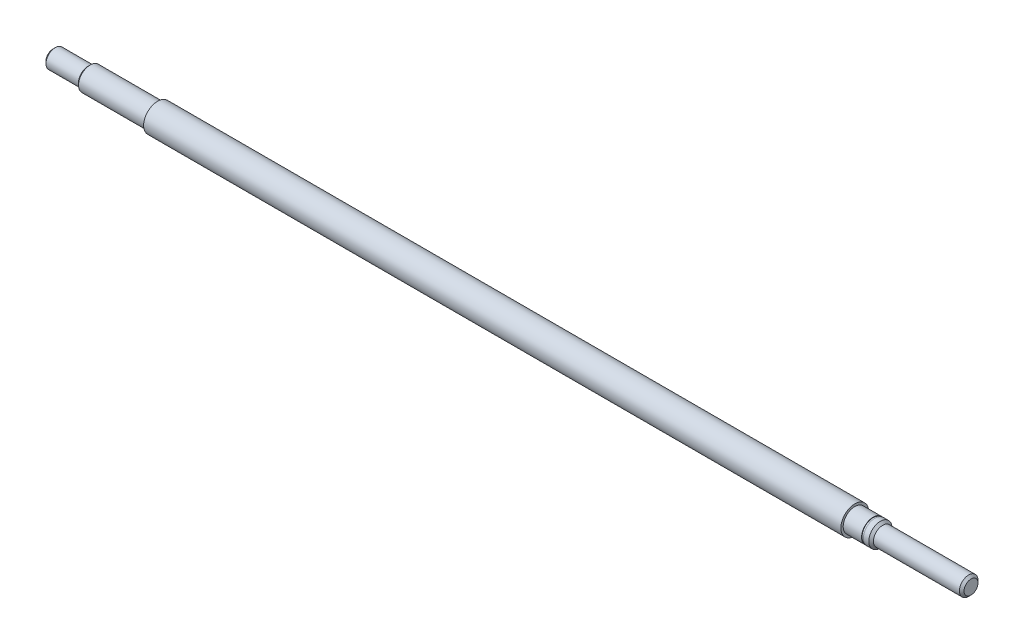
ISO-10303-21;
HEADER;
FILE_DESCRIPTION(('STEP AP214'),'2;1');
FILE_NAME('part.step','',(''),(''),'','','');
FILE_SCHEMA(('AUTOMOTIVE_DESIGN { 1 0 10303 214 1 1 1 1 }'));
ENDSEC;
DATA;
#1=APPLICATION_CONTEXT('core data for automotive mechanical design processes');
#2=APPLICATION_PROTOCOL_DEFINITION('international standard','automotive_design',2000,#1);
#3=PRODUCT_CONTEXT('',#1,'mechanical');
#4=PRODUCT('Part','Part','',(#3));
#5=PRODUCT_RELATED_PRODUCT_CATEGORY('part','',(#4));
#6=PRODUCT_DEFINITION_FORMATION('','',#4);
#7=PRODUCT_DEFINITION_CONTEXT('part definition',#1,'design');
#8=PRODUCT_DEFINITION('design','',#6,#7);
#9=PRODUCT_DEFINITION_SHAPE('','',#8);
#10=(LENGTH_UNIT() NAMED_UNIT(*) SI_UNIT(.MILLI.,.METRE.));
#11=(NAMED_UNIT(*) PLANE_ANGLE_UNIT() SI_UNIT($,.RADIAN.));
#12=(NAMED_UNIT(*) SI_UNIT($,.STERADIAN.) SOLID_ANGLE_UNIT());
#13=UNCERTAINTY_MEASURE_WITH_UNIT(LENGTH_MEASURE(1.E-05),#10,'distance_accuracy_value','');
#14=(GEOMETRIC_REPRESENTATION_CONTEXT(3) GLOBAL_UNCERTAINTY_ASSIGNED_CONTEXT((#13)) GLOBAL_UNIT_ASSIGNED_CONTEXT((#10,
#11,#12)) REPRESENTATION_CONTEXT('',''));
#15=CARTESIAN_POINT('',(0.,0.,0.));
#16=DIRECTION('',(0.,0.,1.));
#17=DIRECTION('',(1.,0.,0.));
#18=AXIS2_PLACEMENT_3D('',#15,#16,#17);
#19=CARTESIAN_POINT('',(0.,0.,0.));
#20=DIRECTION('',(-1.,0.,0.));
#21=DIRECTION('',(0.,0.,1.));
#22=AXIS2_PLACEMENT_3D('',#19,#20,#21);
#23=PLANE('',#22);
#24=CARTESIAN_POINT('',(0.,0.,0.));
#25=DIRECTION('',(-1.,0.,0.));
#26=DIRECTION('',(0.,0.,1.));
#27=AXIS2_PLACEMENT_3D('',#24,#25,#26);
#28=CIRCLE('',#27,3.00000000000006);
#29=CARTESIAN_POINT('',(0.,0.,3.00000000000006));
#30=VERTEX_POINT('',#29);
#31=EDGE_CURVE('E54',#30,#30,#28,.T.);
#32=ORIENTED_EDGE('',*,*,#31,.T.);
#33=EDGE_LOOP('',(#32));
#34=FACE_BOUND('',#33,.T.);
#35=ADVANCED_FACE('F47',(#34),#23,.T.);
#36=CARTESIAN_POINT('',(395.,0.,0.));
#37=DIRECTION('',(1.,0.,0.));
#38=DIRECTION('',(0.,0.,-1.));
#39=AXIS2_PLACEMENT_3D('',#36,#37,#38);
#40=PLANE('',#39);
#41=CARTESIAN_POINT('',(395.,0.,0.));
#42=DIRECTION('',(1.,0.,0.));
#43=DIRECTION('',(0.,0.,-1.));
#44=AXIS2_PLACEMENT_3D('',#41,#42,#43);
#45=CIRCLE('',#44,2.99999999999995);
#46=CARTESIAN_POINT('',(395.,0.,-2.99999999999995));
#47=VERTEX_POINT('',#46);
#48=EDGE_CURVE('E58',#47,#47,#45,.T.);
#49=ORIENTED_EDGE('',*,*,#48,.T.);
#50=EDGE_LOOP('',(#49));
#51=FACE_BOUND('',#50,.T.);
#52=ADVANCED_FACE('F123',(#51),#40,.T.);
#53=CARTESIAN_POINT('',(0.,0.,0.));
#54=DIRECTION('',(-1.,0.,0.));
#55=DIRECTION('',(0.,0.,1.));
#56=AXIS2_PLACEMENT_3D('',#53,#54,#55);
#57=CYLINDRICAL_SURFACE('',#56,4.);
#58=CARTESIAN_POINT('',(394.,0.,0.));
#59=DIRECTION('',(1.,0.,0.));
#60=DIRECTION('',(0.,0.,-1.));
#61=AXIS2_PLACEMENT_3D('',#58,#59,#60);
#62=CIRCLE('',#61,4.);
#63=CARTESIAN_POINT('',(394.,0.,-4.));
#64=VERTEX_POINT('',#63);
#65=EDGE_CURVE('E62',#64,#64,#62,.F.);
#66=ORIENTED_EDGE('',*,*,#65,.T.);
#67=EDGE_LOOP('',(#66));
#68=FACE_BOUND('',#67,.T.);
#69=CARTESIAN_POINT('',(357.,0.,0.));
#70=DIRECTION('',(-1.,0.,0.));
#71=DIRECTION('',(0.,0.,1.));
#72=AXIS2_PLACEMENT_3D('',#69,#70,#71);
#73=CIRCLE('',#72,4.);
#74=CARTESIAN_POINT('',(357.,0.,4.));
#75=VERTEX_POINT('',#74);
#76=EDGE_CURVE('E73',#75,#75,#73,.T.);
#77=ORIENTED_EDGE('',*,*,#76,.F.);
#78=EDGE_LOOP('',(#77));
#79=FACE_BOUND('',#78,.T.);
#80=ADVANCED_FACE('F128',(#68,#79),#57,.T.);
#81=CARTESIAN_POINT('',(0.,0.,0.));
#82=DIRECTION('',(-1.,0.,0.));
#83=DIRECTION('',(0.,0.,1.));
#84=AXIS2_PLACEMENT_3D('',#81,#82,#83);
#85=CYLINDRICAL_SURFACE('',#84,5.);
#86=CARTESIAN_POINT('',(356.,0.,0.));
#87=DIRECTION('',(1.,0.,0.));
#88=DIRECTION('',(0.,0.,-1.));
#89=AXIS2_PLACEMENT_3D('',#86,#87,#88);
#90=CIRCLE('',#89,5.);
#91=CARTESIAN_POINT('',(356.,0.,-5.));
#92=VERTEX_POINT('',#91);
#93=EDGE_CURVE('E67',#92,#92,#90,.F.);
#94=ORIENTED_EDGE('',*,*,#93,.T.);
#95=EDGE_LOOP('',(#94));
#96=FACE_BOUND('',#95,.T.);
#97=CARTESIAN_POINT('',(353.7,0.,0.));
#98=DIRECTION('',(-1.,0.,0.));
#99=DIRECTION('',(0.,0.,1.));
#100=AXIS2_PLACEMENT_3D('',#97,#98,#99);
#101=CIRCLE('',#100,5.);
#102=CARTESIAN_POINT('',(353.7,0.,5.));
#103=VERTEX_POINT('',#102);
#104=EDGE_CURVE('E76',#103,#103,#101,.T.);
#105=ORIENTED_EDGE('',*,*,#104,.F.);
#106=EDGE_LOOP('',(#105));
#107=FACE_BOUND('',#106,.T.);
#108=ADVANCED_FACE('F134',(#96,#107),#85,.T.);
#109=CARTESIAN_POINT('',(353.7,0.,0.));
#110=DIRECTION('',(-1.,0.,0.));
#111=DIRECTION('',(0.,0.,1.));
#112=AXIS2_PLACEMENT_3D('',#109,#110,#111);
#113=PLANE('',#112);
#114=ORIENTED_EDGE('',*,*,#104,.T.);
#115=EDGE_LOOP('',(#114));
#116=FACE_BOUND('',#115,.T.);
#117=CARTESIAN_POINT('',(353.7,0.,0.));
#118=DIRECTION('',(-1.,0.,0.));
#119=DIRECTION('',(0.,0.,1.));
#120=AXIS2_PLACEMENT_3D('',#117,#118,#119);
#121=CIRCLE('',#120,4.8);
#122=CARTESIAN_POINT('',(353.7,0.,4.8));
#123=VERTEX_POINT('',#122);
#124=EDGE_CURVE('E79',#123,#123,#121,.T.);
#125=ORIENTED_EDGE('',*,*,#124,.F.);
#126=EDGE_LOOP('',(#125));
#127=FACE_BOUND('',#126,.T.);
#128=ADVANCED_FACE('F138',(#116,#127),#113,.T.);
#129=CARTESIAN_POINT('',(0.,0.,0.));
#130=DIRECTION('',(-1.,0.,0.));
#131=DIRECTION('',(0.,0.,1.));
#132=AXIS2_PLACEMENT_3D('',#129,#130,#131);
#133=CYLINDRICAL_SURFACE('',#132,4.8);
#134=ORIENTED_EDGE('',*,*,#124,.T.);
#135=EDGE_LOOP('',(#134));
#136=FACE_BOUND('',#135,.T.);
#137=CARTESIAN_POINT('',(352.9,0.,0.));
#138=DIRECTION('',(-1.,0.,0.));
#139=DIRECTION('',(0.,0.,1.));
#140=AXIS2_PLACEMENT_3D('',#137,#138,#139);
#141=CIRCLE('',#140,4.8);
#142=CARTESIAN_POINT('',(352.9,0.,4.8));
#143=VERTEX_POINT('',#142);
#144=EDGE_CURVE('E82',#143,#143,#141,.T.);
#145=ORIENTED_EDGE('',*,*,#144,.F.);
#146=EDGE_LOOP('',(#145));
#147=FACE_BOUND('',#146,.T.);
#148=ADVANCED_FACE('F142',(#136,#147),#133,.T.);
#149=CARTESIAN_POINT('',(352.9,0.,0.));
#150=DIRECTION('',(1.,0.,0.));
#151=DIRECTION('',(0.,0.,-1.));
#152=AXIS2_PLACEMENT_3D('',#149,#150,#151);
#153=PLANE('',#152);
#154=ORIENTED_EDGE('',*,*,#144,.T.);
#155=EDGE_LOOP('',(#154));
#156=FACE_BOUND('',#155,.T.);
#157=CARTESIAN_POINT('',(352.9,0.,0.));
#158=DIRECTION('',(-1.,0.,0.));
#159=DIRECTION('',(0.,0.,1.));
#160=AXIS2_PLACEMENT_3D('',#157,#158,#159);
#161=CIRCLE('',#160,5.);
#162=CARTESIAN_POINT('',(352.9,0.,5.));
#163=VERTEX_POINT('',#162);
#164=EDGE_CURVE('E85',#163,#163,#161,.T.);
#165=ORIENTED_EDGE('',*,*,#164,.F.);
#166=EDGE_LOOP('',(#165));
#167=FACE_BOUND('',#166,.T.);
#168=ADVANCED_FACE('F146',(#156,#167),#153,.T.);
#169=CARTESIAN_POINT('',(0.,0.,0.));
#170=DIRECTION('',(-1.,0.,0.));
#171=DIRECTION('',(0.,0.,1.));
#172=AXIS2_PLACEMENT_3D('',#169,#170,#171);
#173=CYLINDRICAL_SURFACE('',#172,5.);
#174=ORIENTED_EDGE('',*,*,#164,.T.);
#175=EDGE_LOOP('',(#174));
#176=FACE_BOUND('',#175,.T.);
#177=CARTESIAN_POINT('',(345.,0.,0.));
#178=DIRECTION('',(-1.,0.,0.));
#179=DIRECTION('',(0.,0.,1.));
#180=AXIS2_PLACEMENT_3D('',#177,#178,#179);
#181=CIRCLE('',#180,5.);
#182=CARTESIAN_POINT('',(345.,0.,5.));
#183=VERTEX_POINT('',#182);
#184=EDGE_CURVE('E88',#183,#183,#181,.T.);
#185=ORIENTED_EDGE('',*,*,#184,.F.);
#186=EDGE_LOOP('',(#185));
#187=FACE_BOUND('',#186,.T.);
#188=ADVANCED_FACE('F150',(#176,#187),#173,.T.);
#189=CARTESIAN_POINT('',(345.,0.,0.));
#190=DIRECTION('',(1.,0.,0.));
#191=DIRECTION('',(0.,0.,-1.));
#192=AXIS2_PLACEMENT_3D('',#189,#190,#191);
#193=PLANE('',#192);
#194=ORIENTED_EDGE('',*,*,#184,.T.);
#195=EDGE_LOOP('',(#194));
#196=FACE_BOUND('',#195,.T.);
#197=CARTESIAN_POINT('',(345.,0.,0.));
#198=DIRECTION('',(-1.,0.,0.));
#199=DIRECTION('',(0.,0.,1.));
#200=AXIS2_PLACEMENT_3D('',#197,#198,#199);
#201=CIRCLE('',#200,6.);
#202=CARTESIAN_POINT('',(345.,0.,6.));
#203=VERTEX_POINT('',#202);
#204=EDGE_CURVE('E91',#203,#203,#201,.T.);
#205=ORIENTED_EDGE('',*,*,#204,.F.);
#206=EDGE_LOOP('',(#205));
#207=FACE_BOUND('',#206,.T.);
#208=ADVANCED_FACE('F154',(#196,#207),#193,.T.);
#209=CARTESIAN_POINT('',(0.,0.,0.));
#210=DIRECTION('',(-1.,0.,0.));
#211=DIRECTION('',(0.,0.,1.));
#212=AXIS2_PLACEMENT_3D('',#209,#210,#211);
#213=CYLINDRICAL_SURFACE('',#212,6.);
#214=ORIENTED_EDGE('',*,*,#204,.T.);
#215=EDGE_LOOP('',(#214));
#216=FACE_BOUND('',#215,.T.);
#217=CARTESIAN_POINT('',(45.,0.,0.));
#218=DIRECTION('',(-1.,0.,0.));
#219=DIRECTION('',(0.,0.,1.));
#220=AXIS2_PLACEMENT_3D('',#217,#218,#219);
#221=CIRCLE('',#220,6.);
#222=CARTESIAN_POINT('',(45.,0.,6.));
#223=VERTEX_POINT('',#222);
#224=EDGE_CURVE('E94',#223,#223,#221,.T.);
#225=ORIENTED_EDGE('',*,*,#224,.F.);
#226=EDGE_LOOP('',(#225));
#227=FACE_BOUND('',#226,.T.);
#228=ADVANCED_FACE('F158',(#216,#227),#213,.T.);
#229=CARTESIAN_POINT('',(45.,0.,0.));
#230=DIRECTION('',(-1.,0.,0.));
#231=DIRECTION('',(0.,0.,1.));
#232=AXIS2_PLACEMENT_3D('',#229,#230,#231);
#233=PLANE('',#232);
#234=ORIENTED_EDGE('',*,*,#224,.T.);
#235=EDGE_LOOP('',(#234));
#236=FACE_BOUND('',#235,.T.);
#237=CARTESIAN_POINT('',(45.,0.,0.));
#238=DIRECTION('',(-1.,0.,0.));
#239=DIRECTION('',(0.,0.,1.));
#240=AXIS2_PLACEMENT_3D('',#237,#238,#239);
#241=CIRCLE('',#240,5.);
#242=CARTESIAN_POINT('',(45.,0.,5.));
#243=VERTEX_POINT('',#242);
#244=EDGE_CURVE('E97',#243,#243,#241,.T.);
#245=ORIENTED_EDGE('',*,*,#244,.F.);
#246=EDGE_LOOP('',(#245));
#247=FACE_BOUND('',#246,.T.);
#248=ADVANCED_FACE('F162',(#236,#247),#233,.T.);
#249=CARTESIAN_POINT('',(0.,0.,0.));
#250=DIRECTION('',(-1.,0.,0.));
#251=DIRECTION('',(0.,0.,1.));
#252=AXIS2_PLACEMENT_3D('',#249,#250,#251);
#253=CYLINDRICAL_SURFACE('',#252,5.);
#254=CARTESIAN_POINT('',(16.0000000000001,0.,0.));
#255=DIRECTION('',(-1.,0.,0.));
#256=DIRECTION('',(0.,0.,1.));
#257=AXIS2_PLACEMENT_3D('',#254,#255,#256);
#258=CIRCLE('',#257,5.);
#259=CARTESIAN_POINT('',(16.0000000000001,0.,5.));
#260=VERTEX_POINT('',#259);
#261=EDGE_CURVE('E70',#260,#260,#258,.F.);
#262=ORIENTED_EDGE('',*,*,#261,.T.);
#263=EDGE_LOOP('',(#262));
#264=FACE_BOUND('',#263,.T.);
#265=ORIENTED_EDGE('',*,*,#244,.T.);
#266=EDGE_LOOP('',(#265));
#267=FACE_BOUND('',#266,.T.);
#268=ADVANCED_FACE('F118',(#264,#267),#253,.T.);
#269=CARTESIAN_POINT('',(0.,0.,0.));
#270=DIRECTION('',(-1.,0.,0.));
#271=DIRECTION('',(0.,0.,1.));
#272=AXIS2_PLACEMENT_3D('',#269,#270,#271);
#273=CYLINDRICAL_SURFACE('',#272,4.);
#274=CARTESIAN_POINT('',(1.00000000000001,0.,0.));
#275=DIRECTION('',(-1.,0.,0.));
#276=DIRECTION('',(0.,0.,1.));
#277=AXIS2_PLACEMENT_3D('',#274,#275,#276);
#278=CIRCLE('',#277,4.);
#279=CARTESIAN_POINT('',(1.00000000000001,0.,4.));
#280=VERTEX_POINT('',#279);
#281=EDGE_CURVE('E10',#280,#280,#278,.F.);
#282=ORIENTED_EDGE('',*,*,#281,.T.);
#283=EDGE_LOOP('',(#282));
#284=FACE_BOUND('',#283,.T.);
#285=CARTESIAN_POINT('',(15.,0.,0.));
#286=DIRECTION('',(-1.,0.,0.));
#287=DIRECTION('',(0.,0.,1.));
#288=AXIS2_PLACEMENT_3D('',#285,#286,#287);
#289=CIRCLE('',#288,4.);
#290=CARTESIAN_POINT('',(15.,0.,4.));
#291=VERTEX_POINT('',#290);
#292=EDGE_CURVE('E100',#291,#291,#289,.T.);
#293=ORIENTED_EDGE('',*,*,#292,.T.);
#294=EDGE_LOOP('',(#293));
#295=FACE_BOUND('',#294,.T.);
#296=ADVANCED_FACE('F104',(#284,#295),#273,.T.);
#297=CARTESIAN_POINT('',(15.,0.,0.));
#298=DIRECTION('',(1.,0.,0.));
#299=DIRECTION('',(0.,0.,-1.));
#300=AXIS2_PLACEMENT_3D('',#297,#298,#299);
#301=CONICAL_SURFACE('',#300,3.99999999999995,0.785398163397439);
#302=ORIENTED_EDGE('',*,*,#261,.F.);
#303=EDGE_LOOP('',(#302));
#304=FACE_BOUND('',#303,.T.);
#305=ORIENTED_EDGE('',*,*,#292,.F.);
#306=EDGE_LOOP('',(#305));
#307=FACE_BOUND('',#306,.T.);
#308=ADVANCED_FACE('F106',(#304,#307),#301,.T.);
#309=CARTESIAN_POINT('',(356.,0.,0.));
#310=DIRECTION('',(-1.,0.,0.));
#311=DIRECTION('',(0.,0.,1.));
#312=AXIS2_PLACEMENT_3D('',#309,#310,#311);
#313=CONICAL_SURFACE('',#312,5.,0.785398163397474);
#314=ORIENTED_EDGE('',*,*,#76,.T.);
#315=EDGE_LOOP('',(#314));
#316=FACE_BOUND('',#315,.T.);
#317=ORIENTED_EDGE('',*,*,#93,.F.);
#318=EDGE_LOOP('',(#317));
#319=FACE_BOUND('',#318,.T.);
#320=ADVANCED_FACE('F108',(#316,#319),#313,.T.);
#321=CARTESIAN_POINT('',(394.,0.,0.));
#322=DIRECTION('',(-1.,0.,0.));
#323=DIRECTION('',(0.,0.,1.));
#324=AXIS2_PLACEMENT_3D('',#321,#322,#323);
#325=CONICAL_SURFACE('',#324,4.,0.785398163397447);
#326=ORIENTED_EDGE('',*,*,#48,.F.);
#327=EDGE_LOOP('',(#326));
#328=FACE_BOUND('',#327,.T.);
#329=ORIENTED_EDGE('',*,*,#65,.F.);
#330=EDGE_LOOP('',(#329));
#331=FACE_BOUND('',#330,.T.);
#332=ADVANCED_FACE('F115',(#328,#331),#325,.T.);
#333=CARTESIAN_POINT('',(0.,0.,0.));
#334=DIRECTION('',(1.,0.,0.));
#335=DIRECTION('',(0.,0.,-1.));
#336=AXIS2_PLACEMENT_3D('',#333,#334,#335);
#337=CONICAL_SURFACE('',#336,3.00000000000006,0.785398163397414);
#338=ORIENTED_EDGE('',*,*,#281,.F.);
#339=EDGE_LOOP('',(#338));
#340=FACE_BOUND('',#339,.T.);
#341=ORIENTED_EDGE('',*,*,#31,.F.);
#342=EDGE_LOOP('',(#341));
#343=FACE_BOUND('',#342,.T.);
#344=ADVANCED_FACE('F49',(#340,#343),#337,.T.);
#345=CLOSED_SHELL('',(#35,#52,#80,#108,#128,#148,#168,#188,#208,#228,#248,#268,#296,#308,#320,
#332,#344));
#346=MANIFOLD_SOLID_BREP('B2',#345);
#347=ADVANCED_BREP_SHAPE_REPRESENTATION('',(#18,#346),#14);
#348=SHAPE_DEFINITION_REPRESENTATION(#9,#347);
ENDSEC;
END-ISO-10303-21;
